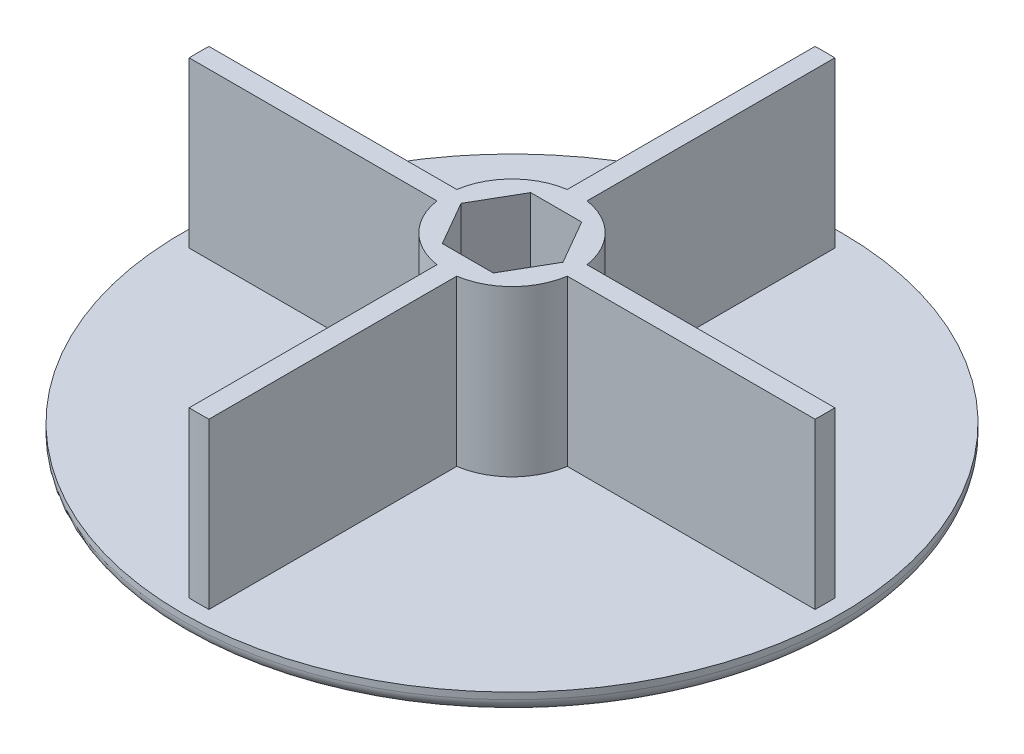
ISO-10303-21;
HEADER;
FILE_DESCRIPTION(('STEP AP214'),'2;1');
FILE_NAME('part.step','',(''),(''),'','','');
FILE_SCHEMA(('AUTOMOTIVE_DESIGN { 1 0 10303 214 1 1 1 1 }'));
ENDSEC;
DATA;
#1=APPLICATION_CONTEXT('core data for automotive mechanical design processes');
#2=APPLICATION_PROTOCOL_DEFINITION('international standard','automotive_design',2000,#1);
#3=PRODUCT_CONTEXT('',#1,'mechanical');
#4=PRODUCT('Part','Part','',(#3));
#5=PRODUCT_RELATED_PRODUCT_CATEGORY('part','',(#4));
#6=PRODUCT_DEFINITION_FORMATION('','',#4);
#7=PRODUCT_DEFINITION_CONTEXT('part definition',#1,'design');
#8=PRODUCT_DEFINITION('design','',#6,#7);
#9=PRODUCT_DEFINITION_SHAPE('','',#8);
#10=(LENGTH_UNIT() NAMED_UNIT(*) SI_UNIT(.MILLI.,.METRE.));
#11=(NAMED_UNIT(*) PLANE_ANGLE_UNIT() SI_UNIT($,.RADIAN.));
#12=(NAMED_UNIT(*) SI_UNIT($,.STERADIAN.) SOLID_ANGLE_UNIT());
#13=UNCERTAINTY_MEASURE_WITH_UNIT(LENGTH_MEASURE(1.E-05),#10,'distance_accuracy_value','');
#14=(GEOMETRIC_REPRESENTATION_CONTEXT(3) GLOBAL_UNCERTAINTY_ASSIGNED_CONTEXT((#13)) GLOBAL_UNIT_ASSIGNED_CONTEXT((#10,
#11,#12)) REPRESENTATION_CONTEXT('',''));
#15=CARTESIAN_POINT('',(0.,0.,0.));
#16=DIRECTION('',(0.,0.,1.));
#17=DIRECTION('',(1.,0.,0.));
#18=AXIS2_PLACEMENT_3D('',#15,#16,#17);
#19=CARTESIAN_POINT('',(0.,3.,0.));
#20=DIRECTION('',(0.,-1.,0.));
#21=DIRECTION('',(0.,0.,-1.));
#22=AXIS2_PLACEMENT_3D('',#19,#20,#21);
#23=CYLINDRICAL_SURFACE('',#22,4.25);
#24=CARTESIAN_POINT('',(0.,2.,0.));
#25=DIRECTION('',(0.,1.,0.));
#26=DIRECTION('',(0.,0.,1.));
#27=AXIS2_PLACEMENT_3D('',#24,#25,#26);
#28=CIRCLE('',#27,4.25);
#29=CARTESIAN_POINT('',(0.,2.,4.25));
#30=VERTEX_POINT('',#29);
#31=EDGE_CURVE('E43',#30,#30,#28,.F.);
#32=ORIENTED_EDGE('',*,*,#31,.T.);
#33=EDGE_LOOP('',(#32));
#34=FACE_BOUND('',#33,.T.);
#35=CARTESIAN_POINT('',(0.,8.,0.));
#36=DIRECTION('',(0.,1.,0.));
#37=DIRECTION('',(0.,0.,1.));
#38=AXIS2_PLACEMENT_3D('',#35,#36,#37);
#39=CIRCLE('',#38,4.25);
#40=CARTESIAN_POINT('',(0.,8.,4.25));
#41=VERTEX_POINT('',#40);
#42=EDGE_CURVE('E230',#41,#41,#39,.T.);
#43=ORIENTED_EDGE('',*,*,#42,.T.);
#44=EDGE_LOOP('',(#43));
#45=FACE_BOUND('',#44,.T.);
#46=ADVANCED_FACE('F35',(#34,#45),#23,.F.);
#47=CARTESIAN_POINT('',(0.,3.,0.));
#48=DIRECTION('',(0.,1.,0.));
#49=DIRECTION('',(0.,0.,1.));
#50=AXIS2_PLACEMENT_3D('',#47,#48,#49);
#51=PLANE('',#50);
#52=CARTESIAN_POINT('',(0.,3.,0.));
#53=DIRECTION('',(0.,1.,0.));
#54=DIRECTION('',(0.,0.,1.));
#55=AXIS2_PLACEMENT_3D('',#52,#53,#54);
#56=CIRCLE('',#55,50.);
#57=CARTESIAN_POINT('',(0.,3.,50.));
#58=VERTEX_POINT('',#57);
#59=EDGE_CURVE('E343',#58,#58,#56,.T.);
#60=ORIENTED_EDGE('',*,*,#59,.T.);
#61=EDGE_LOOP('',(#60));
#62=FACE_BOUND('',#61,.T.);
#63=DIRECTION('',(0.,0.,-1.));
#64=VECTOR('',#63,1.);
#65=CARTESIAN_POINT('',(1.49999999999999,3.,-47.4763098818769));
#66=LINE('',#65,#64);
#67=CARTESIAN_POINT('',(1.49999999999993,3.,-9.88685996664277));
#68=VERTEX_POINT('',#67);
#69=CARTESIAN_POINT('',(1.5,3.,-47.4763098818769));
#70=VERTEX_POINT('',#69);
#71=EDGE_CURVE('E270',#68,#70,#66,.T.);
#72=ORIENTED_EDGE('',*,*,#71,.F.);
#73=CARTESIAN_POINT('',(0.,3.,0.));
#74=DIRECTION('',(0.,1.,0.));
#75=DIRECTION('',(0.,0.,-1.));
#76=AXIS2_PLACEMENT_3D('',#73,#74,#75);
#77=CIRCLE('',#76,10.0000000000002);
#78=CARTESIAN_POINT('',(9.88685996664276,3.,-1.50000000000006));
#79=VERTEX_POINT('',#78);
#80=EDGE_CURVE('E267',#79,#68,#77,.T.);
#81=ORIENTED_EDGE('',*,*,#80,.F.);
#82=DIRECTION('',(-1.,0.,0.));
#83=VECTOR('',#82,1.);
#84=CARTESIAN_POINT('',(9.88685996664276,3.,-1.50000000000006));
#85=LINE('',#84,#83);
#86=CARTESIAN_POINT('',(47.4763098818769,3.,-1.5));
#87=VERTEX_POINT('',#86);
#88=EDGE_CURVE('E236',#87,#79,#85,.T.);
#89=ORIENTED_EDGE('',*,*,#88,.F.);
#90=CARTESIAN_POINT('',(0.,3.,0.));
#91=DIRECTION('',(0.,1.,0.));
#92=DIRECTION('',(0.,0.,-1.));
#93=AXIS2_PLACEMENT_3D('',#90,#91,#92);
#94=CIRCLE('',#93,47.5);
#95=CARTESIAN_POINT('',(47.4763098818769,3.,1.5));
#96=VERTEX_POINT('',#95);
#97=EDGE_CURVE('E296',#96,#87,#94,.T.);
#98=ORIENTED_EDGE('',*,*,#97,.F.);
#99=DIRECTION('',(1.,0.,0.));
#100=VECTOR('',#99,1.);
#101=CARTESIAN_POINT('',(47.4763098818769,3.,1.5));
#102=LINE('',#101,#100);
#103=CARTESIAN_POINT('',(9.88685996664277,3.,1.49999999999994));
#104=VERTEX_POINT('',#103);
#105=EDGE_CURVE('E294',#104,#96,#102,.T.);
#106=ORIENTED_EDGE('',*,*,#105,.F.);
#107=CARTESIAN_POINT('',(0.,3.,0.));
#108=DIRECTION('',(0.,1.,0.));
#109=DIRECTION('',(0.,0.,-1.));
#110=AXIS2_PLACEMENT_3D('',#107,#108,#109);
#111=CIRCLE('',#110,10.0000000000002);
#112=CARTESIAN_POINT('',(1.50000000000006,3.,9.88685996664276));
#113=VERTEX_POINT('',#112);
#114=EDGE_CURVE('E292',#113,#104,#111,.T.);
#115=ORIENTED_EDGE('',*,*,#114,.F.);
#116=DIRECTION('',(0.,0.,-1.));
#117=VECTOR('',#116,1.);
#118=CARTESIAN_POINT('',(1.50000000000006,3.,9.88685996664276));
#119=LINE('',#118,#117);
#120=CARTESIAN_POINT('',(1.5,3.,47.4763098818769));
#121=VERTEX_POINT('',#120);
#122=EDGE_CURVE('E290',#121,#113,#119,.T.);
#123=ORIENTED_EDGE('',*,*,#122,.F.);
#124=CARTESIAN_POINT('',(0.,3.,0.));
#125=DIRECTION('',(0.,1.,0.));
#126=DIRECTION('',(0.,0.,-1.));
#127=AXIS2_PLACEMENT_3D('',#124,#125,#126);
#128=CIRCLE('',#127,47.5);
#129=CARTESIAN_POINT('',(-1.49999999999999,3.,47.4763098818769));
#130=VERTEX_POINT('',#129);
#131=EDGE_CURVE('E288',#130,#121,#128,.T.);
#132=ORIENTED_EDGE('',*,*,#131,.F.);
#133=DIRECTION('',(0.,0.,1.));
#134=VECTOR('',#133,1.);
#135=CARTESIAN_POINT('',(-1.5,3.,47.4763098818769));
#136=LINE('',#135,#134);
#137=CARTESIAN_POINT('',(-1.49999999999994,3.,9.88685996664277));
#138=VERTEX_POINT('',#137);
#139=EDGE_CURVE('E286',#138,#130,#136,.T.);
#140=ORIENTED_EDGE('',*,*,#139,.F.);
#141=CARTESIAN_POINT('',(0.,3.,0.));
#142=DIRECTION('',(0.,1.,0.));
#143=DIRECTION('',(0.,0.,-1.));
#144=AXIS2_PLACEMENT_3D('',#141,#142,#143);
#145=CIRCLE('',#144,10.0000000000002);
#146=CARTESIAN_POINT('',(-9.88685996664276,3.,1.50000000000007));
#147=VERTEX_POINT('',#146);
#148=EDGE_CURVE('E284',#147,#138,#145,.T.);
#149=ORIENTED_EDGE('',*,*,#148,.F.);
#150=DIRECTION('',(1.,0.,0.));
#151=VECTOR('',#150,1.);
#152=CARTESIAN_POINT('',(-9.88685996664276,3.,1.50000000000006));
#153=LINE('',#152,#151);
#154=CARTESIAN_POINT('',(-47.4763098818769,3.,1.5));
#155=VERTEX_POINT('',#154);
#156=EDGE_CURVE('E282',#155,#147,#153,.T.);
#157=ORIENTED_EDGE('',*,*,#156,.F.);
#158=CARTESIAN_POINT('',(0.,3.,0.));
#159=DIRECTION('',(0.,1.,0.));
#160=DIRECTION('',(0.,0.,-1.));
#161=AXIS2_PLACEMENT_3D('',#158,#159,#160);
#162=CIRCLE('',#161,47.5);
#163=CARTESIAN_POINT('',(-47.4763098818769,3.,-1.49999999999999));
#164=VERTEX_POINT('',#163);
#165=EDGE_CURVE('E280',#164,#155,#162,.T.);
#166=ORIENTED_EDGE('',*,*,#165,.F.);
#167=DIRECTION('',(-1.,0.,0.));
#168=VECTOR('',#167,1.);
#169=CARTESIAN_POINT('',(-47.4763098818769,3.,-1.5));
#170=LINE('',#169,#168);
#171=CARTESIAN_POINT('',(-9.88685996664277,3.,-1.49999999999994));
#172=VERTEX_POINT('',#171);
#173=EDGE_CURVE('E278',#172,#164,#170,.T.);
#174=ORIENTED_EDGE('',*,*,#173,.F.);
#175=CARTESIAN_POINT('',(0.,3.,0.));
#176=DIRECTION('',(0.,1.,0.));
#177=DIRECTION('',(0.,0.,-1.));
#178=AXIS2_PLACEMENT_3D('',#175,#176,#177);
#179=CIRCLE('',#178,10.0000000000002);
#180=CARTESIAN_POINT('',(-1.50000000000007,3.,-9.88685996664276));
#181=VERTEX_POINT('',#180);
#182=EDGE_CURVE('E276',#181,#172,#179,.T.);
#183=ORIENTED_EDGE('',*,*,#182,.F.);
#184=DIRECTION('',(0.,0.,1.));
#185=VECTOR('',#184,1.);
#186=CARTESIAN_POINT('',(-1.50000000000007,3.,-9.88685996664276));
#187=LINE('',#186,#185);
#188=CARTESIAN_POINT('',(-1.50000000000001,3.,-47.4763098818769));
#189=VERTEX_POINT('',#188);
#190=EDGE_CURVE('E274',#189,#181,#187,.T.);
#191=ORIENTED_EDGE('',*,*,#190,.F.);
#192=CARTESIAN_POINT('',(0.,3.,0.));
#193=DIRECTION('',(0.,1.,0.));
#194=DIRECTION('',(0.,0.,-1.));
#195=AXIS2_PLACEMENT_3D('',#192,#193,#194);
#196=CIRCLE('',#195,47.5);
#197=EDGE_CURVE('E272',#70,#189,#196,.T.);
#198=ORIENTED_EDGE('',*,*,#197,.F.);
#199=EDGE_LOOP('',(#72,#81,#89,#98,#106,#115,#123,#132,#140,#149,#157,#166,#174,#183,#191,#198));
#200=FACE_BOUND('',#199,.T.);
#201=ADVANCED_FACE('F368',(#62,#200),#51,.T.);
#202=CARTESIAN_POINT('',(0.,0.,0.));
#203=DIRECTION('',(0.,1.,0.));
#204=DIRECTION('',(0.,0.,1.));
#205=AXIS2_PLACEMENT_3D('',#202,#203,#204);
#206=PLANE('',#205);
#207=CARTESIAN_POINT('',(0.,0.,0.));
#208=DIRECTION('',(0.,1.,0.));
#209=DIRECTION('',(0.,0.,1.));
#210=AXIS2_PLACEMENT_3D('',#207,#208,#209);
#211=CIRCLE('',#210,6.25);
#212=CARTESIAN_POINT('',(0.,0.,6.25));
#213=VERTEX_POINT('',#212);
#214=EDGE_CURVE('E351',#213,#213,#211,.T.);
#215=ORIENTED_EDGE('',*,*,#214,.T.);
#216=EDGE_LOOP('',(#215));
#217=FACE_BOUND('',#216,.T.);
#218=CARTESIAN_POINT('',(0.,0.,0.));
#219=DIRECTION('',(0.,1.,0.));
#220=DIRECTION('',(0.,0.,1.));
#221=AXIS2_PLACEMENT_3D('',#218,#219,#220);
#222=CIRCLE('',#221,48.);
#223=CARTESIAN_POINT('',(0.,0.,48.));
#224=VERTEX_POINT('',#223);
#225=EDGE_CURVE('E346',#224,#224,#222,.F.);
#226=ORIENTED_EDGE('',*,*,#225,.T.);
#227=EDGE_LOOP('',(#226));
#228=FACE_BOUND('',#227,.T.);
#229=ADVANCED_FACE('F364',(#217,#228),#206,.F.);
#230=CARTESIAN_POINT('',(0.,3.,0.));
#231=DIRECTION('',(0.,-1.,0.));
#232=DIRECTION('',(0.,0.,-1.));
#233=AXIS2_PLACEMENT_3D('',#230,#231,#232);
#234=CYLINDRICAL_SURFACE('',#233,50.);
#235=CARTESIAN_POINT('',(0.,2.,0.));
#236=DIRECTION('',(0.,1.,0.));
#237=DIRECTION('',(0.,0.,1.));
#238=AXIS2_PLACEMENT_3D('',#235,#236,#237);
#239=CIRCLE('',#238,50.);
#240=CARTESIAN_POINT('',(0.,2.,50.));
#241=VERTEX_POINT('',#240);
#242=EDGE_CURVE('E12',#241,#241,#239,.T.);
#243=ORIENTED_EDGE('',*,*,#242,.T.);
#244=EDGE_LOOP('',(#243));
#245=FACE_BOUND('',#244,.T.);
#246=ORIENTED_EDGE('',*,*,#59,.F.);
#247=EDGE_LOOP('',(#246));
#248=FACE_BOUND('',#247,.T.);
#249=ADVANCED_FACE('F367',(#245,#248),#234,.T.);
#250=CARTESIAN_POINT('',(0.,28.,0.));
#251=DIRECTION('',(0.,-1.,0.));
#252=DIRECTION('',(0.,0.,-1.));
#253=AXIS2_PLACEMENT_3D('',#250,#251,#252);
#254=PLANE('',#253);
#255=DIRECTION('',(-0.5,0.,-0.866025403784438));
#256=VECTOR('',#255,1.);
#257=CARTESIAN_POINT('',(7.73649360714099,28.,0.));
#258=LINE('',#257,#256);
#259=CARTESIAN_POINT('',(7.73649360714099,28.,0.));
#260=VERTEX_POINT('',#259);
#261=CARTESIAN_POINT('',(3.86824680357049,28.,-6.7));
#262=VERTEX_POINT('',#261);
#263=EDGE_CURVE('E201',#260,#262,#258,.T.);
#264=ORIENTED_EDGE('',*,*,#263,.F.);
#265=DIRECTION('',(0.5,0.,-0.866025403784439));
#266=VECTOR('',#265,1.);
#267=CARTESIAN_POINT('',(3.8682468035705,28.,6.7));
#268=LINE('',#267,#266);
#269=CARTESIAN_POINT('',(3.8682468035705,28.,6.7));
#270=VERTEX_POINT('',#269);
#271=EDGE_CURVE('E50',#270,#260,#268,.T.);
#272=ORIENTED_EDGE('',*,*,#271,.F.);
#273=DIRECTION('',(1.,0.,0.));
#274=VECTOR('',#273,1.);
#275=CARTESIAN_POINT('',(-3.86824680357049,28.,6.7));
#276=LINE('',#275,#274);
#277=CARTESIAN_POINT('',(-3.86824680357049,28.,6.7));
#278=VERTEX_POINT('',#277);
#279=EDGE_CURVE('E217',#278,#270,#276,.T.);
#280=ORIENTED_EDGE('',*,*,#279,.F.);
#281=DIRECTION('',(0.5,0.,0.866025403784438));
#282=VECTOR('',#281,1.);
#283=CARTESIAN_POINT('',(-7.73649360714099,28.,0.));
#284=LINE('',#283,#282);
#285=CARTESIAN_POINT('',(-7.73649360714099,28.,0.));
#286=VERTEX_POINT('',#285);
#287=EDGE_CURVE('E211',#286,#278,#284,.T.);
#288=ORIENTED_EDGE('',*,*,#287,.F.);
#289=DIRECTION('',(-0.5,0.,0.866025403784439));
#290=VECTOR('',#289,1.);
#291=CARTESIAN_POINT('',(-3.86824680357049,28.,-6.7));
#292=LINE('',#291,#290);
#293=CARTESIAN_POINT('',(-3.86824680357049,28.,-6.7));
#294=VERTEX_POINT('',#293);
#295=EDGE_CURVE('E209',#294,#286,#292,.T.);
#296=ORIENTED_EDGE('',*,*,#295,.F.);
#297=DIRECTION('',(-1.,0.,0.));
#298=VECTOR('',#297,1.);
#299=CARTESIAN_POINT('',(3.86824680357049,28.,-6.7));
#300=LINE('',#299,#298);
#301=EDGE_CURVE('E191',#262,#294,#300,.T.);
#302=ORIENTED_EDGE('',*,*,#301,.F.);
#303=EDGE_LOOP('',(#264,#272,#280,#288,#296,#302));
#304=FACE_BOUND('',#303,.T.);
#305=CARTESIAN_POINT('',(0.,28.,0.));
#306=DIRECTION('',(0.,1.,0.));
#307=DIRECTION('',(0.,0.,-1.));
#308=AXIS2_PLACEMENT_3D('',#305,#306,#307);
#309=CIRCLE('',#308,10.0000000000002);
#310=CARTESIAN_POINT('',(9.88685996664276,28.,-1.50000000000006));
#311=VERTEX_POINT('',#310);
#312=CARTESIAN_POINT('',(1.49999999999993,28.,-9.88685996664277));
#313=VERTEX_POINT('',#312);
#314=EDGE_CURVE('E232',#311,#313,#309,.T.);
#315=ORIENTED_EDGE('',*,*,#314,.T.);
#316=DIRECTION('',(0.,0.,-1.));
#317=VECTOR('',#316,1.);
#318=CARTESIAN_POINT('',(1.49999999999999,28.,-47.4763098818769));
#319=LINE('',#318,#317);
#320=CARTESIAN_POINT('',(1.5,28.,-47.4763098818769));
#321=VERTEX_POINT('',#320);
#322=EDGE_CURVE('E235',#313,#321,#319,.T.);
#323=ORIENTED_EDGE('',*,*,#322,.T.);
#324=CARTESIAN_POINT('',(0.,28.,0.));
#325=DIRECTION('',(0.,1.,0.));
#326=DIRECTION('',(0.,0.,-1.));
#327=AXIS2_PLACEMENT_3D('',#324,#325,#326);
#328=CIRCLE('',#327,47.5);
#329=CARTESIAN_POINT('',(-1.50000000000001,28.,-47.4763098818769));
#330=VERTEX_POINT('',#329);
#331=EDGE_CURVE('E238',#321,#330,#328,.T.);
#332=ORIENTED_EDGE('',*,*,#331,.T.);
#333=DIRECTION('',(0.,0.,1.));
#334=VECTOR('',#333,1.);
#335=CARTESIAN_POINT('',(-1.50000000000007,28.,-9.88685996664276));
#336=LINE('',#335,#334);
#337=CARTESIAN_POINT('',(-1.50000000000007,28.,-9.88685996664276));
#338=VERTEX_POINT('',#337);
#339=EDGE_CURVE('E240',#330,#338,#336,.T.);
#340=ORIENTED_EDGE('',*,*,#339,.T.);
#341=CARTESIAN_POINT('',(0.,28.,0.));
#342=DIRECTION('',(0.,1.,0.));
#343=DIRECTION('',(0.,0.,-1.));
#344=AXIS2_PLACEMENT_3D('',#341,#342,#343);
#345=CIRCLE('',#344,10.0000000000002);
#346=CARTESIAN_POINT('',(-9.88685996664277,28.,-1.49999999999994));
#347=VERTEX_POINT('',#346);
#348=EDGE_CURVE('E242',#338,#347,#345,.T.);
#349=ORIENTED_EDGE('',*,*,#348,.T.);
#350=DIRECTION('',(-1.,0.,0.));
#351=VECTOR('',#350,1.);
#352=CARTESIAN_POINT('',(-47.4763098818769,28.,-1.5));
#353=LINE('',#352,#351);
#354=CARTESIAN_POINT('',(-47.4763098818769,28.,-1.49999999999999));
#355=VERTEX_POINT('',#354);
#356=EDGE_CURVE('E244',#347,#355,#353,.T.);
#357=ORIENTED_EDGE('',*,*,#356,.T.);
#358=CARTESIAN_POINT('',(0.,28.,0.));
#359=DIRECTION('',(0.,1.,0.));
#360=DIRECTION('',(0.,0.,-1.));
#361=AXIS2_PLACEMENT_3D('',#358,#359,#360);
#362=CIRCLE('',#361,47.5);
#363=CARTESIAN_POINT('',(-47.4763098818769,28.,1.5));
#364=VERTEX_POINT('',#363);
#365=EDGE_CURVE('E246',#355,#364,#362,.T.);
#366=ORIENTED_EDGE('',*,*,#365,.T.);
#367=DIRECTION('',(1.,0.,0.));
#368=VECTOR('',#367,1.);
#369=CARTESIAN_POINT('',(-9.88685996664276,28.,1.50000000000006));
#370=LINE('',#369,#368);
#371=CARTESIAN_POINT('',(-9.88685996664276,28.,1.50000000000007));
#372=VERTEX_POINT('',#371);
#373=EDGE_CURVE('E248',#364,#372,#370,.T.);
#374=ORIENTED_EDGE('',*,*,#373,.T.);
#375=CARTESIAN_POINT('',(0.,28.,0.));
#376=DIRECTION('',(0.,1.,0.));
#377=DIRECTION('',(0.,0.,-1.));
#378=AXIS2_PLACEMENT_3D('',#375,#376,#377);
#379=CIRCLE('',#378,10.0000000000002);
#380=CARTESIAN_POINT('',(-1.49999999999994,28.,9.88685996664277));
#381=VERTEX_POINT('',#380);
#382=EDGE_CURVE('E250',#372,#381,#379,.T.);
#383=ORIENTED_EDGE('',*,*,#382,.T.);
#384=DIRECTION('',(0.,0.,1.));
#385=VECTOR('',#384,1.);
#386=CARTESIAN_POINT('',(-1.5,28.,47.4763098818769));
#387=LINE('',#386,#385);
#388=CARTESIAN_POINT('',(-1.49999999999999,28.,47.4763098818769));
#389=VERTEX_POINT('',#388);
#390=EDGE_CURVE('E252',#381,#389,#387,.T.);
#391=ORIENTED_EDGE('',*,*,#390,.T.);
#392=CARTESIAN_POINT('',(0.,28.,0.));
#393=DIRECTION('',(0.,1.,0.));
#394=DIRECTION('',(0.,0.,-1.));
#395=AXIS2_PLACEMENT_3D('',#392,#393,#394);
#396=CIRCLE('',#395,47.5);
#397=CARTESIAN_POINT('',(1.5,28.,47.4763098818769));
#398=VERTEX_POINT('',#397);
#399=EDGE_CURVE('E254',#389,#398,#396,.T.);
#400=ORIENTED_EDGE('',*,*,#399,.T.);
#401=DIRECTION('',(0.,0.,-1.));
#402=VECTOR('',#401,1.);
#403=CARTESIAN_POINT('',(1.50000000000006,28.,9.88685996664276));
#404=LINE('',#403,#402);
#405=CARTESIAN_POINT('',(1.50000000000006,28.,9.88685996664276));
#406=VERTEX_POINT('',#405);
#407=EDGE_CURVE('E256',#398,#406,#404,.T.);
#408=ORIENTED_EDGE('',*,*,#407,.T.);
#409=CARTESIAN_POINT('',(0.,28.,0.));
#410=DIRECTION('',(0.,1.,0.));
#411=DIRECTION('',(0.,0.,-1.));
#412=AXIS2_PLACEMENT_3D('',#409,#410,#411);
#413=CIRCLE('',#412,10.0000000000002);
#414=CARTESIAN_POINT('',(9.88685996664277,28.,1.49999999999994));
#415=VERTEX_POINT('',#414);
#416=EDGE_CURVE('E258',#406,#415,#413,.T.);
#417=ORIENTED_EDGE('',*,*,#416,.T.);
#418=DIRECTION('',(1.,0.,0.));
#419=VECTOR('',#418,1.);
#420=CARTESIAN_POINT('',(47.4763098818769,28.,1.5));
#421=LINE('',#420,#419);
#422=CARTESIAN_POINT('',(47.4763098818769,28.,1.5));
#423=VERTEX_POINT('',#422);
#424=EDGE_CURVE('E260',#415,#423,#421,.T.);
#425=ORIENTED_EDGE('',*,*,#424,.T.);
#426=CARTESIAN_POINT('',(0.,28.,0.));
#427=DIRECTION('',(0.,1.,0.));
#428=DIRECTION('',(0.,0.,-1.));
#429=AXIS2_PLACEMENT_3D('',#426,#427,#428);
#430=CIRCLE('',#429,47.5);
#431=CARTESIAN_POINT('',(47.4763098818769,28.,-1.5));
#432=VERTEX_POINT('',#431);
#433=EDGE_CURVE('E262',#423,#432,#430,.T.);
#434=ORIENTED_EDGE('',*,*,#433,.T.);
#435=DIRECTION('',(-1.,0.,0.));
#436=VECTOR('',#435,1.);
#437=CARTESIAN_POINT('',(9.88685996664276,28.,-1.50000000000006));
#438=LINE('',#437,#436);
#439=EDGE_CURVE('E264',#432,#311,#438,.T.);
#440=ORIENTED_EDGE('',*,*,#439,.T.);
#441=EDGE_LOOP('',(#315,#323,#332,#340,#349,#357,#366,#374,#383,#391,#400,#408,#417,#425,#434,#440));
#442=FACE_BOUND('',#441,.T.);
#443=ADVANCED_FACE('F205',(#304,#442),#254,.F.);
#444=CARTESIAN_POINT('',(0.,28.,0.));
#445=DIRECTION('',(0.,-1.,0.));
#446=DIRECTION('',(0.,0.,-1.));
#447=AXIS2_PLACEMENT_3D('',#444,#445,#446);
#448=CYLINDRICAL_SURFACE('',#447,10.0000000000002);
#449=ORIENTED_EDGE('',*,*,#80,.T.);
#450=DIRECTION('',(0.,-1.,0.));
#451=VECTOR('',#450,1.);
#452=CARTESIAN_POINT('',(1.49999999999993,28.,-9.88685996664277));
#453=LINE('',#452,#451);
#454=EDGE_CURVE('E341',#313,#68,#453,.T.);
#455=ORIENTED_EDGE('',*,*,#454,.F.);
#456=ORIENTED_EDGE('',*,*,#314,.F.);
#457=DIRECTION('',(0.,-1.,0.));
#458=VECTOR('',#457,1.);
#459=CARTESIAN_POINT('',(9.88685996664276,28.,-1.50000000000006));
#460=LINE('',#459,#458);
#461=EDGE_CURVE('E266',#311,#79,#460,.T.);
#462=ORIENTED_EDGE('',*,*,#461,.T.);
#463=EDGE_LOOP('',(#449,#455,#456,#462));
#464=FACE_BOUND('',#463,.T.);
#465=ADVANCED_FACE('F402',(#464),#448,.T.);
#466=CARTESIAN_POINT('',(1.49999999999999,28.,-47.4763098818769));
#467=DIRECTION('',(-1.,0.,0.));
#468=DIRECTION('',(0.,0.,1.));
#469=AXIS2_PLACEMENT_3D('',#466,#467,#468);
#470=PLANE('',#469);
#471=ORIENTED_EDGE('',*,*,#71,.T.);
#472=DIRECTION('',(0.,-1.,0.));
#473=VECTOR('',#472,1.);
#474=CARTESIAN_POINT('',(1.5,28.,-47.4763098818769));
#475=LINE('',#474,#473);
#476=EDGE_CURVE('E338',#321,#70,#475,.T.);
#477=ORIENTED_EDGE('',*,*,#476,.F.);
#478=ORIENTED_EDGE('',*,*,#322,.F.);
#479=ORIENTED_EDGE('',*,*,#454,.T.);
#480=EDGE_LOOP('',(#471,#477,#478,#479));
#481=FACE_BOUND('',#480,.T.);
#482=ADVANCED_FACE('F391',(#481),#470,.F.);
#483=CARTESIAN_POINT('',(0.,28.,0.));
#484=DIRECTION('',(0.,-1.,0.));
#485=DIRECTION('',(0.,0.,-1.));
#486=AXIS2_PLACEMENT_3D('',#483,#484,#485);
#487=CYLINDRICAL_SURFACE('',#486,47.5);
#488=ORIENTED_EDGE('',*,*,#197,.T.);
#489=DIRECTION('',(0.,-1.,0.));
#490=VECTOR('',#489,1.);
#491=CARTESIAN_POINT('',(-1.50000000000001,28.,-47.4763098818769));
#492=LINE('',#491,#490);
#493=EDGE_CURVE('E335',#330,#189,#492,.T.);
#494=ORIENTED_EDGE('',*,*,#493,.F.);
#495=ORIENTED_EDGE('',*,*,#331,.F.);
#496=ORIENTED_EDGE('',*,*,#476,.T.);
#497=EDGE_LOOP('',(#488,#494,#495,#496));
#498=FACE_BOUND('',#497,.T.);
#499=ADVANCED_FACE('F395',(#498),#487,.T.);
#500=CARTESIAN_POINT('',(-1.50000000000007,28.,-9.88685996664276));
#501=DIRECTION('',(1.,0.,0.));
#502=DIRECTION('',(0.,0.,-1.));
#503=AXIS2_PLACEMENT_3D('',#500,#501,#502);
#504=PLANE('',#503);
#505=ORIENTED_EDGE('',*,*,#190,.T.);
#506=DIRECTION('',(0.,-1.,0.));
#507=VECTOR('',#506,1.);
#508=CARTESIAN_POINT('',(-1.50000000000007,28.,-9.88685996664276));
#509=LINE('',#508,#507);
#510=EDGE_CURVE('E332',#338,#181,#509,.T.);
#511=ORIENTED_EDGE('',*,*,#510,.F.);
#512=ORIENTED_EDGE('',*,*,#339,.F.);
#513=ORIENTED_EDGE('',*,*,#493,.T.);
#514=EDGE_LOOP('',(#505,#511,#512,#513));
#515=FACE_BOUND('',#514,.T.);
#516=ADVANCED_FACE('F459',(#515),#504,.F.);
#517=CARTESIAN_POINT('',(0.,28.,0.));
#518=DIRECTION('',(0.,-1.,0.));
#519=DIRECTION('',(0.,0.,-1.));
#520=AXIS2_PLACEMENT_3D('',#517,#518,#519);
#521=CYLINDRICAL_SURFACE('',#520,10.0000000000002);
#522=ORIENTED_EDGE('',*,*,#182,.T.);
#523=DIRECTION('',(0.,-1.,0.));
#524=VECTOR('',#523,1.);
#525=CARTESIAN_POINT('',(-9.88685996664277,28.,-1.49999999999994));
#526=LINE('',#525,#524);
#527=EDGE_CURVE('E329',#347,#172,#526,.T.);
#528=ORIENTED_EDGE('',*,*,#527,.F.);
#529=ORIENTED_EDGE('',*,*,#348,.F.);
#530=ORIENTED_EDGE('',*,*,#510,.T.);
#531=EDGE_LOOP('',(#522,#528,#529,#530));
#532=FACE_BOUND('',#531,.T.);
#533=ADVANCED_FACE('F457',(#532),#521,.T.);
#534=CARTESIAN_POINT('',(-47.4763098818769,28.,-1.5));
#535=DIRECTION('',(0.,0.,1.));
#536=DIRECTION('',(1.,0.,0.));
#537=AXIS2_PLACEMENT_3D('',#534,#535,#536);
#538=PLANE('',#537);
#539=ORIENTED_EDGE('',*,*,#173,.T.);
#540=DIRECTION('',(0.,-1.,0.));
#541=VECTOR('',#540,1.);
#542=CARTESIAN_POINT('',(-47.4763098818769,28.,-1.49999999999999));
#543=LINE('',#542,#541);
#544=EDGE_CURVE('E326',#355,#164,#543,.T.);
#545=ORIENTED_EDGE('',*,*,#544,.F.);
#546=ORIENTED_EDGE('',*,*,#356,.F.);
#547=ORIENTED_EDGE('',*,*,#527,.T.);
#548=EDGE_LOOP('',(#539,#545,#546,#547));
#549=FACE_BOUND('',#548,.T.);
#550=ADVANCED_FACE('F452',(#549),#538,.F.);
#551=CARTESIAN_POINT('',(0.,28.,0.));
#552=DIRECTION('',(0.,-1.,0.));
#553=DIRECTION('',(0.,0.,-1.));
#554=AXIS2_PLACEMENT_3D('',#551,#552,#553);
#555=CYLINDRICAL_SURFACE('',#554,47.5);
#556=ORIENTED_EDGE('',*,*,#165,.T.);
#557=DIRECTION('',(0.,-1.,0.));
#558=VECTOR('',#557,1.);
#559=CARTESIAN_POINT('',(-47.4763098818769,28.,1.5));
#560=LINE('',#559,#558);
#561=EDGE_CURVE('E323',#364,#155,#560,.T.);
#562=ORIENTED_EDGE('',*,*,#561,.F.);
#563=ORIENTED_EDGE('',*,*,#365,.F.);
#564=ORIENTED_EDGE('',*,*,#544,.T.);
#565=EDGE_LOOP('',(#556,#562,#563,#564));
#566=FACE_BOUND('',#565,.T.);
#567=ADVANCED_FACE('F447',(#566),#555,.T.);
#568=CARTESIAN_POINT('',(-9.88685996664276,28.,1.50000000000006));
#569=DIRECTION('',(0.,0.,-1.));
#570=DIRECTION('',(-1.,0.,0.));
#571=AXIS2_PLACEMENT_3D('',#568,#569,#570);
#572=PLANE('',#571);
#573=ORIENTED_EDGE('',*,*,#156,.T.);
#574=DIRECTION('',(0.,-1.,0.));
#575=VECTOR('',#574,1.);
#576=CARTESIAN_POINT('',(-9.88685996664276,28.,1.50000000000007));
#577=LINE('',#576,#575);
#578=EDGE_CURVE('E320',#372,#147,#577,.T.);
#579=ORIENTED_EDGE('',*,*,#578,.F.);
#580=ORIENTED_EDGE('',*,*,#373,.F.);
#581=ORIENTED_EDGE('',*,*,#561,.T.);
#582=EDGE_LOOP('',(#573,#579,#580,#581));
#583=FACE_BOUND('',#582,.T.);
#584=ADVANCED_FACE('F443',(#583),#572,.F.);
#585=CARTESIAN_POINT('',(0.,28.,0.));
#586=DIRECTION('',(0.,-1.,0.));
#587=DIRECTION('',(0.,0.,-1.));
#588=AXIS2_PLACEMENT_3D('',#585,#586,#587);
#589=CYLINDRICAL_SURFACE('',#588,10.0000000000002);
#590=ORIENTED_EDGE('',*,*,#148,.T.);
#591=DIRECTION('',(0.,-1.,0.));
#592=VECTOR('',#591,1.);
#593=CARTESIAN_POINT('',(-1.49999999999994,28.,9.88685996664277));
#594=LINE('',#593,#592);
#595=EDGE_CURVE('E317',#381,#138,#594,.T.);
#596=ORIENTED_EDGE('',*,*,#595,.F.);
#597=ORIENTED_EDGE('',*,*,#382,.F.);
#598=ORIENTED_EDGE('',*,*,#578,.T.);
#599=EDGE_LOOP('',(#590,#596,#597,#598));
#600=FACE_BOUND('',#599,.T.);
#601=ADVANCED_FACE('F438',(#600),#589,.T.);
#602=CARTESIAN_POINT('',(-1.5,28.,47.4763098818769));
#603=DIRECTION('',(1.,0.,0.));
#604=DIRECTION('',(0.,0.,-1.));
#605=AXIS2_PLACEMENT_3D('',#602,#603,#604);
#606=PLANE('',#605);
#607=ORIENTED_EDGE('',*,*,#139,.T.);
#608=DIRECTION('',(0.,-1.,0.));
#609=VECTOR('',#608,1.);
#610=CARTESIAN_POINT('',(-1.49999999999999,28.,47.4763098818769));
#611=LINE('',#610,#609);
#612=EDGE_CURVE('E314',#389,#130,#611,.T.);
#613=ORIENTED_EDGE('',*,*,#612,.F.);
#614=ORIENTED_EDGE('',*,*,#390,.F.);
#615=ORIENTED_EDGE('',*,*,#595,.T.);
#616=EDGE_LOOP('',(#607,#613,#614,#615));
#617=FACE_BOUND('',#616,.T.);
#618=ADVANCED_FACE('F432',(#617),#606,.F.);
#619=CARTESIAN_POINT('',(0.,28.,0.));
#620=DIRECTION('',(0.,-1.,0.));
#621=DIRECTION('',(0.,0.,-1.));
#622=AXIS2_PLACEMENT_3D('',#619,#620,#621);
#623=CYLINDRICAL_SURFACE('',#622,47.5);
#624=ORIENTED_EDGE('',*,*,#131,.T.);
#625=DIRECTION('',(0.,-1.,0.));
#626=VECTOR('',#625,1.);
#627=CARTESIAN_POINT('',(1.5,28.,47.4763098818769));
#628=LINE('',#627,#626);
#629=EDGE_CURVE('E311',#398,#121,#628,.T.);
#630=ORIENTED_EDGE('',*,*,#629,.F.);
#631=ORIENTED_EDGE('',*,*,#399,.F.);
#632=ORIENTED_EDGE('',*,*,#612,.T.);
#633=EDGE_LOOP('',(#624,#630,#631,#632));
#634=FACE_BOUND('',#633,.T.);
#635=ADVANCED_FACE('F428',(#634),#623,.T.);
#636=CARTESIAN_POINT('',(1.50000000000006,28.,9.88685996664276));
#637=DIRECTION('',(-1.,0.,0.));
#638=DIRECTION('',(0.,0.,1.));
#639=AXIS2_PLACEMENT_3D('',#636,#637,#638);
#640=PLANE('',#639);
#641=ORIENTED_EDGE('',*,*,#122,.T.);
#642=DIRECTION('',(0.,-1.,0.));
#643=VECTOR('',#642,1.);
#644=CARTESIAN_POINT('',(1.50000000000006,28.,9.88685996664276));
#645=LINE('',#644,#643);
#646=EDGE_CURVE('E308',#406,#113,#645,.T.);
#647=ORIENTED_EDGE('',*,*,#646,.F.);
#648=ORIENTED_EDGE('',*,*,#407,.F.);
#649=ORIENTED_EDGE('',*,*,#629,.T.);
#650=EDGE_LOOP('',(#641,#647,#648,#649));
#651=FACE_BOUND('',#650,.T.);
#652=ADVANCED_FACE('F423',(#651),#640,.F.);
#653=CARTESIAN_POINT('',(0.,28.,0.));
#654=DIRECTION('',(0.,-1.,0.));
#655=DIRECTION('',(0.,0.,-1.));
#656=AXIS2_PLACEMENT_3D('',#653,#654,#655);
#657=CYLINDRICAL_SURFACE('',#656,10.0000000000002);
#658=ORIENTED_EDGE('',*,*,#114,.T.);
#659=DIRECTION('',(0.,-1.,0.));
#660=VECTOR('',#659,1.);
#661=CARTESIAN_POINT('',(9.88685996664277,28.,1.49999999999994));
#662=LINE('',#661,#660);
#663=EDGE_CURVE('E305',#415,#104,#662,.T.);
#664=ORIENTED_EDGE('',*,*,#663,.F.);
#665=ORIENTED_EDGE('',*,*,#416,.F.);
#666=ORIENTED_EDGE('',*,*,#646,.T.);
#667=EDGE_LOOP('',(#658,#664,#665,#666));
#668=FACE_BOUND('',#667,.T.);
#669=ADVANCED_FACE('F417',(#668),#657,.T.);
#670=CARTESIAN_POINT('',(47.4763098818769,28.,1.5));
#671=DIRECTION('',(0.,0.,-1.));
#672=DIRECTION('',(-1.,0.,0.));
#673=AXIS2_PLACEMENT_3D('',#670,#671,#672);
#674=PLANE('',#673);
#675=ORIENTED_EDGE('',*,*,#105,.T.);
#676=DIRECTION('',(0.,-1.,0.));
#677=VECTOR('',#676,1.);
#678=CARTESIAN_POINT('',(47.4763098818769,28.,1.5));
#679=LINE('',#678,#677);
#680=EDGE_CURVE('E302',#423,#96,#679,.T.);
#681=ORIENTED_EDGE('',*,*,#680,.F.);
#682=ORIENTED_EDGE('',*,*,#424,.F.);
#683=ORIENTED_EDGE('',*,*,#663,.T.);
#684=EDGE_LOOP('',(#675,#681,#682,#683));
#685=FACE_BOUND('',#684,.T.);
#686=ADVANCED_FACE('F413',(#685),#674,.F.);
#687=CARTESIAN_POINT('',(0.,28.,0.));
#688=DIRECTION('',(0.,-1.,0.));
#689=DIRECTION('',(0.,0.,-1.));
#690=AXIS2_PLACEMENT_3D('',#687,#688,#689);
#691=CYLINDRICAL_SURFACE('',#690,47.5);
#692=ORIENTED_EDGE('',*,*,#97,.T.);
#693=DIRECTION('',(0.,-1.,0.));
#694=VECTOR('',#693,1.);
#695=CARTESIAN_POINT('',(47.4763098818769,28.,-1.5));
#696=LINE('',#695,#694);
#697=EDGE_CURVE('E58',#432,#87,#696,.T.);
#698=ORIENTED_EDGE('',*,*,#697,.F.);
#699=ORIENTED_EDGE('',*,*,#433,.F.);
#700=ORIENTED_EDGE('',*,*,#680,.T.);
#701=EDGE_LOOP('',(#692,#698,#699,#700));
#702=FACE_BOUND('',#701,.T.);
#703=ADVANCED_FACE('F408',(#702),#691,.T.);
#704=CARTESIAN_POINT('',(9.88685996664276,28.,-1.50000000000006));
#705=DIRECTION('',(0.,0.,1.));
#706=DIRECTION('',(1.,0.,0.));
#707=AXIS2_PLACEMENT_3D('',#704,#705,#706);
#708=PLANE('',#707);
#709=ORIENTED_EDGE('',*,*,#88,.T.);
#710=ORIENTED_EDGE('',*,*,#461,.F.);
#711=ORIENTED_EDGE('',*,*,#439,.F.);
#712=ORIENTED_EDGE('',*,*,#697,.T.);
#713=EDGE_LOOP('',(#709,#710,#711,#712));
#714=FACE_BOUND('',#713,.T.);
#715=ADVANCED_FACE('F403',(#714),#708,.F.);
#716=CARTESIAN_POINT('',(3.8682468035705,-20.4688381041361,6.7));
#717=DIRECTION('',(0.866025403784439,0.,0.5));
#718=DIRECTION('',(0.5,0.,-0.866025403784439));
#719=AXIS2_PLACEMENT_3D('',#716,#717,#718);
#720=PLANE('',#719);
#721=DIRECTION('',(-0.5,0.,0.866025403784439));
#722=VECTOR('',#721,1.);
#723=CARTESIAN_POINT('',(3.8682468035705,8.,6.7));
#724=LINE('',#723,#722);
#725=CARTESIAN_POINT('',(7.73649360714099,8.,0.));
#726=VERTEX_POINT('',#725);
#727=CARTESIAN_POINT('',(3.8682468035705,8.,6.7));
#728=VERTEX_POINT('',#727);
#729=EDGE_CURVE('E231',#726,#728,#724,.T.);
#730=ORIENTED_EDGE('',*,*,#729,.T.);
#731=DIRECTION('',(0.,1.,0.));
#732=VECTOR('',#731,1.);
#733=CARTESIAN_POINT('',(3.8682468035705,-20.4688381041361,6.7));
#734=LINE('',#733,#732);
#735=EDGE_CURVE('E220',#728,#270,#734,.T.);
#736=ORIENTED_EDGE('',*,*,#735,.T.);
#737=ORIENTED_EDGE('',*,*,#271,.T.);
#738=DIRECTION('',(0.,1.,0.));
#739=VECTOR('',#738,1.);
#740=CARTESIAN_POINT('',(7.73649360714099,-20.4688381041361,0.));
#741=LINE('',#740,#739);
#742=EDGE_CURVE('E198',#726,#260,#741,.T.);
#743=ORIENTED_EDGE('',*,*,#742,.F.);
#744=EDGE_LOOP('',(#730,#736,#737,#743));
#745=FACE_BOUND('',#744,.T.);
#746=ADVANCED_FACE('F584',(#745),#720,.F.);
#747=CARTESIAN_POINT('',(-3.86824680357049,-20.4688381041361,6.7));
#748=DIRECTION('',(0.,0.,1.));
#749=DIRECTION('',(1.,0.,0.));
#750=AXIS2_PLACEMENT_3D('',#747,#748,#749);
#751=PLANE('',#750);
#752=DIRECTION('',(-1.,0.,0.));
#753=VECTOR('',#752,1.);
#754=CARTESIAN_POINT('',(-3.86824680357049,8.,6.7));
#755=LINE('',#754,#753);
#756=CARTESIAN_POINT('',(-3.86824680357049,8.,6.7));
#757=VERTEX_POINT('',#756);
#758=EDGE_CURVE('E706',#728,#757,#755,.T.);
#759=ORIENTED_EDGE('',*,*,#758,.T.);
#760=DIRECTION('',(0.,1.,0.));
#761=VECTOR('',#760,1.);
#762=CARTESIAN_POINT('',(-3.86824680357049,-20.4688381041361,6.7));
#763=LINE('',#762,#761);
#764=EDGE_CURVE('E222',#757,#278,#763,.T.);
#765=ORIENTED_EDGE('',*,*,#764,.T.);
#766=ORIENTED_EDGE('',*,*,#279,.T.);
#767=ORIENTED_EDGE('',*,*,#735,.F.);
#768=EDGE_LOOP('',(#759,#765,#766,#767));
#769=FACE_BOUND('',#768,.T.);
#770=ADVANCED_FACE('F603',(#769),#751,.F.);
#771=CARTESIAN_POINT('',(-7.73649360714099,-20.4688381041361,0.));
#772=DIRECTION('',(-0.866025403784438,0.,0.5));
#773=DIRECTION('',(0.5,0.,0.866025403784439));
#774=AXIS2_PLACEMENT_3D('',#771,#772,#773);
#775=PLANE('',#774);
#776=DIRECTION('',(-0.5,0.,-0.866025403784439));
#777=VECTOR('',#776,1.);
#778=CARTESIAN_POINT('',(-7.73649360714099,8.,0.));
#779=LINE('',#778,#777);
#780=CARTESIAN_POINT('',(-7.73649360714099,8.,0.));
#781=VERTEX_POINT('',#780);
#782=EDGE_CURVE('E709',#757,#781,#779,.T.);
#783=ORIENTED_EDGE('',*,*,#782,.T.);
#784=DIRECTION('',(0.,1.,0.));
#785=VECTOR('',#784,1.);
#786=CARTESIAN_POINT('',(-7.73649360714099,-20.4688381041361,0.));
#787=LINE('',#786,#785);
#788=EDGE_CURVE('E224',#781,#286,#787,.T.);
#789=ORIENTED_EDGE('',*,*,#788,.T.);
#790=ORIENTED_EDGE('',*,*,#287,.T.);
#791=ORIENTED_EDGE('',*,*,#764,.F.);
#792=EDGE_LOOP('',(#783,#789,#790,#791));
#793=FACE_BOUND('',#792,.T.);
#794=ADVANCED_FACE('F613',(#793),#775,.F.);
#795=CARTESIAN_POINT('',(-3.86824680357049,-20.4688381041361,-6.7));
#796=DIRECTION('',(-0.866025403784439,0.,-0.5));
#797=DIRECTION('',(-0.5,0.,0.866025403784439));
#798=AXIS2_PLACEMENT_3D('',#795,#796,#797);
#799=PLANE('',#798);
#800=DIRECTION('',(0.5,0.,-0.866025403784439));
#801=VECTOR('',#800,1.);
#802=CARTESIAN_POINT('',(-3.86824680357049,8.,-6.7));
#803=LINE('',#802,#801);
#804=CARTESIAN_POINT('',(-3.86824680357049,8.,-6.7));
#805=VERTEX_POINT('',#804);
#806=EDGE_CURVE('E713',#781,#805,#803,.T.);
#807=ORIENTED_EDGE('',*,*,#806,.T.);
#808=DIRECTION('',(0.,1.,0.));
#809=VECTOR('',#808,1.);
#810=CARTESIAN_POINT('',(-3.86824680357049,-20.4688381041361,-6.7));
#811=LINE('',#810,#809);
#812=EDGE_CURVE('E197',#805,#294,#811,.T.);
#813=ORIENTED_EDGE('',*,*,#812,.T.);
#814=ORIENTED_EDGE('',*,*,#295,.T.);
#815=ORIENTED_EDGE('',*,*,#788,.F.);
#816=EDGE_LOOP('',(#807,#813,#814,#815));
#817=FACE_BOUND('',#816,.T.);
#818=ADVANCED_FACE('F623',(#817),#799,.F.);
#819=CARTESIAN_POINT('',(3.86824680357049,-20.4688381041361,-6.7));
#820=DIRECTION('',(0.,0.,-1.));
#821=DIRECTION('',(-1.,0.,0.));
#822=AXIS2_PLACEMENT_3D('',#819,#820,#821);
#823=PLANE('',#822);
#824=DIRECTION('',(1.,0.,0.));
#825=VECTOR('',#824,1.);
#826=CARTESIAN_POINT('',(3.86824680357049,8.,-6.7));
#827=LINE('',#826,#825);
#828=CARTESIAN_POINT('',(3.86824680357049,8.,-6.7));
#829=VERTEX_POINT('',#828);
#830=EDGE_CURVE('E194',#805,#829,#827,.T.);
#831=ORIENTED_EDGE('',*,*,#830,.T.);
#832=DIRECTION('',(0.,1.,0.));
#833=VECTOR('',#832,1.);
#834=CARTESIAN_POINT('',(3.86824680357049,-20.4688381041361,-6.7));
#835=LINE('',#834,#833);
#836=EDGE_CURVE('E186',#829,#262,#835,.T.);
#837=ORIENTED_EDGE('',*,*,#836,.T.);
#838=ORIENTED_EDGE('',*,*,#301,.T.);
#839=ORIENTED_EDGE('',*,*,#812,.F.);
#840=EDGE_LOOP('',(#831,#837,#838,#839));
#841=FACE_BOUND('',#840,.T.);
#842=ADVANCED_FACE('F188',(#841),#823,.F.);
#843=CARTESIAN_POINT('',(7.73649360714099,-20.4688381041361,0.));
#844=DIRECTION('',(0.866025403784438,0.,-0.5));
#845=DIRECTION('',(-0.5,0.,-0.866025403784439));
#846=AXIS2_PLACEMENT_3D('',#843,#844,#845);
#847=PLANE('',#846);
#848=DIRECTION('',(0.5,0.,0.866025403784439));
#849=VECTOR('',#848,1.);
#850=CARTESIAN_POINT('',(7.73649360714099,8.,0.));
#851=LINE('',#850,#849);
#852=EDGE_CURVE('E228',#829,#726,#851,.T.);
#853=ORIENTED_EDGE('',*,*,#852,.T.);
#854=ORIENTED_EDGE('',*,*,#742,.T.);
#855=ORIENTED_EDGE('',*,*,#263,.T.);
#856=ORIENTED_EDGE('',*,*,#836,.F.);
#857=EDGE_LOOP('',(#853,#854,#855,#856));
#858=FACE_BOUND('',#857,.T.);
#859=ADVANCED_FACE('F202',(#858),#847,.F.);
#860=CARTESIAN_POINT('',(0.,8.,0.));
#861=DIRECTION('',(0.,1.,0.));
#862=DIRECTION('',(0.,0.,1.));
#863=AXIS2_PLACEMENT_3D('',#860,#861,#862);
#864=PLANE('',#863);
#865=ORIENTED_EDGE('',*,*,#42,.F.);
#866=EDGE_LOOP('',(#865));
#867=FACE_BOUND('',#866,.T.);
#868=ORIENTED_EDGE('',*,*,#729,.F.);
#869=ORIENTED_EDGE('',*,*,#852,.F.);
#870=ORIENTED_EDGE('',*,*,#830,.F.);
#871=ORIENTED_EDGE('',*,*,#806,.F.);
#872=ORIENTED_EDGE('',*,*,#782,.F.);
#873=ORIENTED_EDGE('',*,*,#758,.F.);
#874=EDGE_LOOP('',(#868,#869,#870,#871,#872,#873));
#875=FACE_BOUND('',#874,.T.);
#876=ADVANCED_FACE('F361',(#867,#875),#864,.T.);
#877=CARTESIAN_POINT('',(0.,2.,0.));
#878=DIRECTION('',(0.,1.,0.));
#879=DIRECTION('',(0.,0.,1.));
#880=AXIS2_PLACEMENT_3D('',#877,#878,#879);
#881=TOROIDAL_SURFACE('',#880,6.25,2.);
#882=ORIENTED_EDGE('',*,*,#31,.F.);
#883=EDGE_LOOP('',(#882));
#884=FACE_BOUND('',#883,.T.);
#885=ORIENTED_EDGE('',*,*,#214,.F.);
#886=EDGE_LOOP('',(#885));
#887=FACE_BOUND('',#886,.T.);
#888=ADVANCED_FACE('F358',(#884,#887),#881,.T.);
#889=CARTESIAN_POINT('',(0.,2.,0.));
#890=DIRECTION('',(0.,1.,0.));
#891=DIRECTION('',(0.,0.,1.));
#892=AXIS2_PLACEMENT_3D('',#889,#890,#891);
#893=TOROIDAL_SURFACE('',#892,48.,2.);
#894=ORIENTED_EDGE('',*,*,#225,.F.);
#895=EDGE_LOOP('',(#894));
#896=FACE_BOUND('',#895,.T.);
#897=ORIENTED_EDGE('',*,*,#242,.F.);
#898=EDGE_LOOP('',(#897));
#899=FACE_BOUND('',#898,.T.);
#900=ADVANCED_FACE('F37',(#896,#899),#893,.T.);
#901=CLOSED_SHELL('',(#46,#201,#229,#249,#443,#465,#482,#499,#516,#533,#550,#567,#584,#601,#618,
#635,#652,#669,#686,#703,#715,#746,#770,#794,#818,#842,#859,#876,#888,#900));
#902=MANIFOLD_SOLID_BREP('B2',#901);
#903=ADVANCED_BREP_SHAPE_REPRESENTATION('',(#18,#902),#14);
#904=SHAPE_DEFINITION_REPRESENTATION(#9,#903);
ENDSEC;
END-ISO-10303-21;
